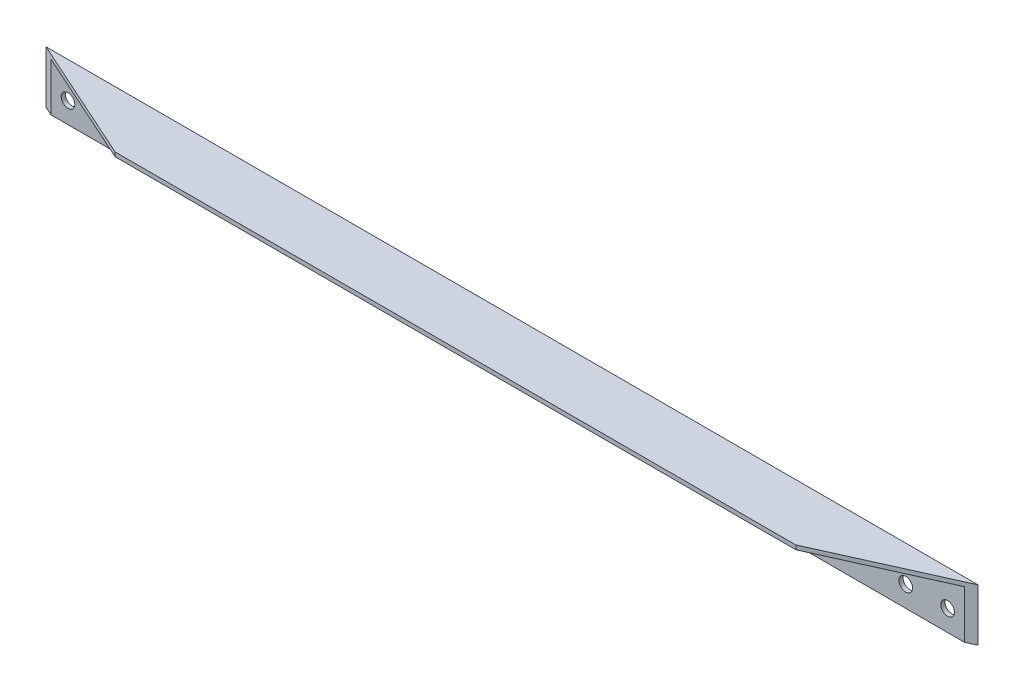
ISO-10303-21;
HEADER;
FILE_DESCRIPTION(('STEP AP214'),'2;1');
FILE_NAME('part.step','',(''),(''),'','','');
FILE_SCHEMA(('AUTOMOTIVE_DESIGN { 1 0 10303 214 1 1 1 1 }'));
ENDSEC;
DATA;
#1=APPLICATION_CONTEXT('core data for automotive mechanical design processes');
#2=APPLICATION_PROTOCOL_DEFINITION('international standard','automotive_design',2000,#1);
#3=PRODUCT_CONTEXT('',#1,'mechanical');
#4=PRODUCT('Part','Part','',(#3));
#5=PRODUCT_RELATED_PRODUCT_CATEGORY('part','',(#4));
#6=PRODUCT_DEFINITION_FORMATION('','',#4);
#7=PRODUCT_DEFINITION_CONTEXT('part definition',#1,'design');
#8=PRODUCT_DEFINITION('design','',#6,#7);
#9=PRODUCT_DEFINITION_SHAPE('','',#8);
#10=(LENGTH_UNIT() NAMED_UNIT(*) SI_UNIT(.MILLI.,.METRE.));
#11=(NAMED_UNIT(*) PLANE_ANGLE_UNIT() SI_UNIT($,.RADIAN.));
#12=(NAMED_UNIT(*) SI_UNIT($,.STERADIAN.) SOLID_ANGLE_UNIT());
#13=UNCERTAINTY_MEASURE_WITH_UNIT(LENGTH_MEASURE(1.E-05),#10,'distance_accuracy_value','');
#14=(GEOMETRIC_REPRESENTATION_CONTEXT(3) GLOBAL_UNCERTAINTY_ASSIGNED_CONTEXT((#13)) GLOBAL_UNIT_ASSIGNED_CONTEXT((#10,
#11,#12)) REPRESENTATION_CONTEXT('',''));
#15=CARTESIAN_POINT('',(0.,0.,0.));
#16=DIRECTION('',(0.,0.,1.));
#17=DIRECTION('',(1.,0.,0.));
#18=AXIS2_PLACEMENT_3D('',#15,#16,#17);
#19=CARTESIAN_POINT('',(-890.,100.,8.));
#20=DIRECTION('',(0.,0.,-1.));
#21=DIRECTION('',(-1.,0.,0.));
#22=AXIS2_PLACEMENT_3D('',#19,#20,#21);
#23=PLANE('',#22);
#24=CARTESIAN_POINT('',(-760.,39.9999999999999,8.));
#25=DIRECTION('',(0.,0.,1.));
#26=DIRECTION('',(-1.,0.,0.));
#27=AXIS2_PLACEMENT_3D('',#24,#25,#26);
#28=CIRCLE('',#27,12.9999999999998);
#29=CARTESIAN_POINT('',(-773.,39.9999999999999,8.));
#30=VERTEX_POINT('',#29);
#31=EDGE_CURVE('E106',#30,#30,#28,.T.);
#32=ORIENTED_EDGE('',*,*,#31,.F.);
#33=EDGE_LOOP('',(#32));
#34=FACE_BOUND('',#33,.T.);
#35=CARTESIAN_POINT('',(760.,39.9999999999999,8.));
#36=DIRECTION('',(0.,0.,1.));
#37=DIRECTION('',(1.,0.,0.));
#38=AXIS2_PLACEMENT_3D('',#35,#36,#37);
#39=CIRCLE('',#38,12.9999999999998);
#40=CARTESIAN_POINT('',(773.,39.9999999999999,8.));
#41=VERTEX_POINT('',#40);
#42=EDGE_CURVE('E121',#41,#41,#39,.T.);
#43=ORIENTED_EDGE('',*,*,#42,.F.);
#44=EDGE_LOOP('',(#43));
#45=FACE_BOUND('',#44,.T.);
#46=CARTESIAN_POINT('',(840.,39.9999999999999,8.));
#47=DIRECTION('',(0.,0.,1.));
#48=DIRECTION('',(1.,0.,0.));
#49=AXIS2_PLACEMENT_3D('',#46,#47,#48);
#50=CIRCLE('',#49,12.9999999999998);
#51=CARTESIAN_POINT('',(853.,39.9999999999999,8.));
#52=VERTEX_POINT('',#51);
#53=EDGE_CURVE('E127',#52,#52,#50,.T.);
#54=ORIENTED_EDGE('',*,*,#53,.F.);
#55=EDGE_LOOP('',(#54));
#56=FACE_BOUND('',#55,.T.);
#57=CARTESIAN_POINT('',(-840.,39.9999999999999,8.));
#58=DIRECTION('',(0.,0.,1.));
#59=DIRECTION('',(-1.,0.,0.));
#60=AXIS2_PLACEMENT_3D('',#57,#58,#59);
#61=CIRCLE('',#60,12.9999999999998);
#62=CARTESIAN_POINT('',(-853.,39.9999999999999,8.));
#63=VERTEX_POINT('',#62);
#64=EDGE_CURVE('E115',#63,#63,#61,.T.);
#65=ORIENTED_EDGE('',*,*,#64,.F.);
#66=EDGE_LOOP('',(#65));
#67=FACE_BOUND('',#66,.T.);
#68=DIRECTION('',(1.,0.,0.));
#69=VECTOR('',#68,1.);
#70=CARTESIAN_POINT('',(-890.,92.,8.));
#71=LINE('',#70,#69);
#72=CARTESIAN_POINT('',(-872.222222222222,92.,8.));
#73=VERTEX_POINT('',#72);
#74=CARTESIAN_POINT('',(872.222222222222,92.,8.));
#75=VERTEX_POINT('',#74);
#76=EDGE_CURVE('E38',#73,#75,#71,.T.);
#77=ORIENTED_EDGE('',*,*,#76,.F.);
#78=DIRECTION('',(0.,-1.,0.));
#79=VECTOR('',#78,1.);
#80=CARTESIAN_POINT('',(-872.222222222222,100.,8.));
#81=LINE('',#80,#79);
#82=CARTESIAN_POINT('',(-872.222222222222,0.,8.));
#83=VERTEX_POINT('',#82);
#84=EDGE_CURVE('E166',#73,#83,#81,.T.);
#85=ORIENTED_EDGE('',*,*,#84,.T.);
#86=DIRECTION('',(1.,0.,0.));
#87=VECTOR('',#86,1.);
#88=CARTESIAN_POINT('',(-890.,0.,8.));
#89=LINE('',#88,#87);
#90=CARTESIAN_POINT('',(872.222222222222,0.,8.));
#91=VERTEX_POINT('',#90);
#92=EDGE_CURVE('E133',#83,#91,#89,.T.);
#93=ORIENTED_EDGE('',*,*,#92,.T.);
#94=DIRECTION('',(0.,1.,0.));
#95=VECTOR('',#94,1.);
#96=CARTESIAN_POINT('',(872.222222222222,100.,8.));
#97=LINE('',#96,#95);
#98=EDGE_CURVE('E151',#91,#75,#97,.T.);
#99=ORIENTED_EDGE('',*,*,#98,.T.);
#100=EDGE_LOOP('',(#77,#85,#93,#99));
#101=FACE_BOUND('',#100,.T.);
#102=ADVANCED_FACE('F34',(#34,#45,#56,#67,#101),#23,.F.);
#103=CARTESIAN_POINT('',(-890.,100.,0.));
#104=DIRECTION('',(0.,0.,-1.));
#105=DIRECTION('',(-1.,0.,0.));
#106=AXIS2_PLACEMENT_3D('',#103,#104,#105);
#107=PLANE('',#106);
#108=CARTESIAN_POINT('',(-840.,39.9999999999999,0.));
#109=DIRECTION('',(0.,0.,1.));
#110=DIRECTION('',(-1.,0.,0.));
#111=AXIS2_PLACEMENT_3D('',#108,#109,#110);
#112=CIRCLE('',#111,12.9999999999998);
#113=CARTESIAN_POINT('',(-853.,39.9999999999999,0.));
#114=VERTEX_POINT('',#113);
#115=EDGE_CURVE('E113',#114,#114,#112,.T.);
#116=ORIENTED_EDGE('',*,*,#115,.T.);
#117=EDGE_LOOP('',(#116));
#118=FACE_BOUND('',#117,.T.);
#119=CARTESIAN_POINT('',(840.,39.9999999999999,0.));
#120=DIRECTION('',(0.,0.,1.));
#121=DIRECTION('',(1.,0.,0.));
#122=AXIS2_PLACEMENT_3D('',#119,#120,#121);
#123=CIRCLE('',#122,12.9999999999998);
#124=CARTESIAN_POINT('',(853.,39.9999999999999,0.));
#125=VERTEX_POINT('',#124);
#126=EDGE_CURVE('E124',#125,#125,#123,.T.);
#127=ORIENTED_EDGE('',*,*,#126,.T.);
#128=EDGE_LOOP('',(#127));
#129=FACE_BOUND('',#128,.T.);
#130=DIRECTION('',(0.,-1.,0.));
#131=VECTOR('',#130,1.);
#132=CARTESIAN_POINT('',(-890.,0.,0.));
#133=LINE('',#132,#131);
#134=CARTESIAN_POINT('',(-890.,100.,0.));
#135=VERTEX_POINT('',#134);
#136=CARTESIAN_POINT('',(-890.,0.,0.));
#137=VERTEX_POINT('',#136);
#138=EDGE_CURVE('E130',#135,#137,#133,.T.);
#139=ORIENTED_EDGE('',*,*,#138,.F.);
#140=DIRECTION('',(-1.,0.,0.));
#141=VECTOR('',#140,1.);
#142=CARTESIAN_POINT('',(-890.,100.,0.));
#143=LINE('',#142,#141);
#144=CARTESIAN_POINT('',(890.,100.,0.));
#145=VERTEX_POINT('',#144);
#146=EDGE_CURVE('E98',#145,#135,#143,.T.);
#147=ORIENTED_EDGE('',*,*,#146,.F.);
#148=DIRECTION('',(0.,1.,0.));
#149=VECTOR('',#148,1.);
#150=CARTESIAN_POINT('',(890.,0.,0.));
#151=LINE('',#150,#149);
#152=CARTESIAN_POINT('',(890.,0.,0.));
#153=VERTEX_POINT('',#152);
#154=EDGE_CURVE('E139',#153,#145,#151,.T.);
#155=ORIENTED_EDGE('',*,*,#154,.F.);
#156=DIRECTION('',(1.,0.,0.));
#157=VECTOR('',#156,1.);
#158=CARTESIAN_POINT('',(-890.,0.,0.));
#159=LINE('',#158,#157);
#160=EDGE_CURVE('E136',#137,#153,#159,.T.);
#161=ORIENTED_EDGE('',*,*,#160,.F.);
#162=EDGE_LOOP('',(#139,#147,#155,#161));
#163=FACE_BOUND('',#162,.T.);
#164=CARTESIAN_POINT('',(760.,39.9999999999999,0.));
#165=DIRECTION('',(0.,0.,1.));
#166=DIRECTION('',(1.,0.,0.));
#167=AXIS2_PLACEMENT_3D('',#164,#165,#166);
#168=CIRCLE('',#167,12.9999999999998);
#169=CARTESIAN_POINT('',(773.,39.9999999999999,0.));
#170=VERTEX_POINT('',#169);
#171=EDGE_CURVE('E118',#170,#170,#168,.T.);
#172=ORIENTED_EDGE('',*,*,#171,.T.);
#173=EDGE_LOOP('',(#172));
#174=FACE_BOUND('',#173,.T.);
#175=CARTESIAN_POINT('',(-760.,39.9999999999999,0.));
#176=DIRECTION('',(0.,0.,1.));
#177=DIRECTION('',(-1.,0.,0.));
#178=AXIS2_PLACEMENT_3D('',#175,#176,#177);
#179=CIRCLE('',#178,12.9999999999998);
#180=CARTESIAN_POINT('',(-773.,39.9999999999999,0.));
#181=VERTEX_POINT('',#180);
#182=EDGE_CURVE('E102',#181,#181,#179,.T.);
#183=ORIENTED_EDGE('',*,*,#182,.T.);
#184=EDGE_LOOP('',(#183));
#185=FACE_BOUND('',#184,.T.);
#186=ADVANCED_FACE('F170',(#118,#129,#163,#174,#185),#107,.T.);
#187=CARTESIAN_POINT('',(-890.,0.,8.));
#188=DIRECTION('',(0.,1.,0.));
#189=DIRECTION('',(0.,0.,1.));
#190=AXIS2_PLACEMENT_3D('',#187,#188,#189);
#191=PLANE('',#190);
#192=ORIENTED_EDGE('',*,*,#92,.F.);
#193=DIRECTION('',(-0.911921505175107,0.,-0.410364677328798));
#194=VECTOR('',#193,1.);
#195=CARTESIAN_POINT('',(-887.006237006237,0.,1.34719334719335));
#196=LINE('',#195,#194);
#197=EDGE_CURVE('E155',#83,#137,#196,.T.);
#198=ORIENTED_EDGE('',*,*,#197,.T.);
#199=ORIENTED_EDGE('',*,*,#160,.T.);
#200=DIRECTION('',(-0.911921505175107,0.,0.410364677328798));
#201=VECTOR('',#200,1.);
#202=CARTESIAN_POINT('',(-593.243243243243,0.,667.459459459459));
#203=LINE('',#202,#201);
#204=EDGE_CURVE('E153',#153,#91,#203,.T.);
#205=ORIENTED_EDGE('',*,*,#204,.T.);
#206=EDGE_LOOP('',(#192,#198,#199,#205));
#207=FACE_BOUND('',#206,.T.);
#208=ADVANCED_FACE('F36',(#207),#191,.F.);
#209=CARTESIAN_POINT('',(-890.,100.,8.));
#210=DIRECTION('',(0.,-1.,0.));
#211=DIRECTION('',(0.,0.,-1.));
#212=AXIS2_PLACEMENT_3D('',#209,#210,#211);
#213=PLANE('',#212);
#214=ORIENTED_EDGE('',*,*,#146,.T.);
#215=DIRECTION('',(-0.911921505175107,0.,-0.410364677328798));
#216=VECTOR('',#215,1.);
#217=CARTESIAN_POINT('',(-650.,100.,108.));
#218=LINE('',#217,#216);
#219=CARTESIAN_POINT('',(-650.,100.,108.));
#220=VERTEX_POINT('',#219);
#221=EDGE_CURVE('E88',#220,#135,#218,.T.);
#222=ORIENTED_EDGE('',*,*,#221,.F.);
#223=DIRECTION('',(-1.,0.,0.));
#224=VECTOR('',#223,1.);
#225=CARTESIAN_POINT('',(-890.,100.,108.));
#226=LINE('',#225,#224);
#227=CARTESIAN_POINT('',(650.,100.,108.));
#228=VERTEX_POINT('',#227);
#229=EDGE_CURVE('E96',#228,#220,#226,.T.);
#230=ORIENTED_EDGE('',*,*,#229,.F.);
#231=DIRECTION('',(-0.911921505175107,0.,0.410364677328798));
#232=VECTOR('',#231,1.);
#233=CARTESIAN_POINT('',(650.,100.,108.));
#234=LINE('',#233,#232);
#235=EDGE_CURVE('E58',#145,#228,#234,.T.);
#236=ORIENTED_EDGE('',*,*,#235,.F.);
#237=EDGE_LOOP('',(#214,#222,#230,#236));
#238=FACE_BOUND('',#237,.T.);
#239=ADVANCED_FACE('F95',(#238),#213,.F.);
#240=CARTESIAN_POINT('',(840.,39.9999999999999,8.));
#241=DIRECTION('',(0.,0.,-1.));
#242=DIRECTION('',(-1.,0.,0.));
#243=AXIS2_PLACEMENT_3D('',#240,#241,#242);
#244=CYLINDRICAL_SURFACE('',#243,12.9999999999998);
#245=ORIENTED_EDGE('',*,*,#53,.T.);
#246=EDGE_LOOP('',(#245));
#247=FACE_BOUND('',#246,.T.);
#248=ORIENTED_EDGE('',*,*,#126,.F.);
#249=EDGE_LOOP('',(#248));
#250=FACE_BOUND('',#249,.T.);
#251=ADVANCED_FACE('F200',(#247,#250),#244,.F.);
#252=CARTESIAN_POINT('',(760.,39.9999999999999,8.));
#253=DIRECTION('',(0.,0.,-1.));
#254=DIRECTION('',(-1.,0.,0.));
#255=AXIS2_PLACEMENT_3D('',#252,#253,#254);
#256=CYLINDRICAL_SURFACE('',#255,12.9999999999998);
#257=ORIENTED_EDGE('',*,*,#42,.T.);
#258=EDGE_LOOP('',(#257));
#259=FACE_BOUND('',#258,.T.);
#260=ORIENTED_EDGE('',*,*,#171,.F.);
#261=EDGE_LOOP('',(#260));
#262=FACE_BOUND('',#261,.T.);
#263=ADVANCED_FACE('F189',(#259,#262),#256,.F.);
#264=CARTESIAN_POINT('',(-840.,39.9999999999999,8.));
#265=DIRECTION('',(0.,0.,-1.));
#266=DIRECTION('',(-1.,0.,0.));
#267=AXIS2_PLACEMENT_3D('',#264,#265,#266);
#268=CYLINDRICAL_SURFACE('',#267,12.9999999999998);
#269=ORIENTED_EDGE('',*,*,#64,.T.);
#270=EDGE_LOOP('',(#269));
#271=FACE_BOUND('',#270,.T.);
#272=ORIENTED_EDGE('',*,*,#115,.F.);
#273=EDGE_LOOP('',(#272));
#274=FACE_BOUND('',#273,.T.);
#275=ADVANCED_FACE('F181',(#271,#274),#268,.F.);
#276=CARTESIAN_POINT('',(-760.,39.9999999999999,8.));
#277=DIRECTION('',(0.,0.,-1.));
#278=DIRECTION('',(-1.,0.,0.));
#279=AXIS2_PLACEMENT_3D('',#276,#277,#278);
#280=CYLINDRICAL_SURFACE('',#279,12.9999999999998);
#281=ORIENTED_EDGE('',*,*,#31,.T.);
#282=EDGE_LOOP('',(#281));
#283=FACE_BOUND('',#282,.T.);
#284=ORIENTED_EDGE('',*,*,#182,.F.);
#285=EDGE_LOOP('',(#284));
#286=FACE_BOUND('',#285,.T.);
#287=ADVANCED_FACE('F179',(#283,#286),#280,.F.);
#288=CARTESIAN_POINT('',(-890.,92.,108.));
#289=DIRECTION('',(0.,1.,0.));
#290=DIRECTION('',(0.,0.,1.));
#291=AXIS2_PLACEMENT_3D('',#288,#289,#290);
#292=PLANE('',#291);
#293=DIRECTION('',(1.,0.,0.));
#294=VECTOR('',#293,1.);
#295=CARTESIAN_POINT('',(-890.,92.,108.));
#296=LINE('',#295,#294);
#297=CARTESIAN_POINT('',(-650.,92.,108.));
#298=VERTEX_POINT('',#297);
#299=CARTESIAN_POINT('',(650.,92.,108.));
#300=VERTEX_POINT('',#299);
#301=EDGE_CURVE('E103',#298,#300,#296,.T.);
#302=ORIENTED_EDGE('',*,*,#301,.F.);
#303=DIRECTION('',(-0.911921505175107,0.,-0.410364677328798));
#304=VECTOR('',#303,1.);
#305=CARTESIAN_POINT('',(-849.5841995842,92.,18.1871101871102));
#306=LINE('',#305,#304);
#307=EDGE_CURVE('E50',#298,#73,#306,.T.);
#308=ORIENTED_EDGE('',*,*,#307,.T.);
#309=ORIENTED_EDGE('',*,*,#76,.T.);
#310=DIRECTION('',(-0.911921505175107,0.,0.410364677328798));
#311=VECTOR('',#310,1.);
#312=CARTESIAN_POINT('',(-630.665280665281,92.,684.299376299376));
#313=LINE('',#312,#311);
#314=EDGE_CURVE('E146',#75,#300,#313,.T.);
#315=ORIENTED_EDGE('',*,*,#314,.T.);
#316=EDGE_LOOP('',(#302,#308,#309,#315));
#317=FACE_BOUND('',#316,.T.);
#318=ADVANCED_FACE('F149',(#317),#292,.F.);
#319=CARTESIAN_POINT('',(-890.,92.,108.));
#320=DIRECTION('',(0.,0.,1.));
#321=DIRECTION('',(1.,0.,0.));
#322=AXIS2_PLACEMENT_3D('',#319,#320,#321);
#323=PLANE('',#322);
#324=DIRECTION('',(0.,1.,0.));
#325=VECTOR('',#324,1.);
#326=CARTESIAN_POINT('',(-650.,92.,108.));
#327=LINE('',#326,#325);
#328=EDGE_CURVE('E11',#298,#220,#327,.T.);
#329=ORIENTED_EDGE('',*,*,#328,.F.);
#330=ORIENTED_EDGE('',*,*,#301,.T.);
#331=DIRECTION('',(0.,-1.,0.));
#332=VECTOR('',#331,1.);
#333=CARTESIAN_POINT('',(650.,92.,108.));
#334=LINE('',#333,#332);
#335=EDGE_CURVE('E44',#228,#300,#334,.T.);
#336=ORIENTED_EDGE('',*,*,#335,.F.);
#337=ORIENTED_EDGE('',*,*,#229,.T.);
#338=EDGE_LOOP('',(#329,#330,#336,#337));
#339=FACE_BOUND('',#338,.T.);
#340=ADVANCED_FACE('F101',(#339),#323,.T.);
#341=CARTESIAN_POINT('',(650.,-2.50000000007189E-05,108.));
#342=DIRECTION('',(-0.410364677328798,0.,-0.911921505175107));
#343=DIRECTION('',(-0.911921505175107,0.,0.410364677328798));
#344=AXIS2_PLACEMENT_3D('',#341,#342,#343);
#345=PLANE('',#344);
#346=ORIENTED_EDGE('',*,*,#154,.T.);
#347=ORIENTED_EDGE('',*,*,#235,.T.);
#348=ORIENTED_EDGE('',*,*,#335,.T.);
#349=ORIENTED_EDGE('',*,*,#314,.F.);
#350=ORIENTED_EDGE('',*,*,#98,.F.);
#351=ORIENTED_EDGE('',*,*,#204,.F.);
#352=EDGE_LOOP('',(#346,#347,#348,#349,#350,#351));
#353=FACE_BOUND('',#352,.T.);
#354=ADVANCED_FACE('F144',(#353),#345,.F.);
#355=CARTESIAN_POINT('',(-650.,-2.50000000007189E-05,108.));
#356=DIRECTION('',(0.410364677328798,0.,-0.911921505175107));
#357=DIRECTION('',(-0.911921505175107,0.,-0.410364677328798));
#358=AXIS2_PLACEMENT_3D('',#355,#356,#357);
#359=PLANE('',#358);
#360=ORIENTED_EDGE('',*,*,#84,.F.);
#361=ORIENTED_EDGE('',*,*,#307,.F.);
#362=ORIENTED_EDGE('',*,*,#328,.T.);
#363=ORIENTED_EDGE('',*,*,#221,.T.);
#364=ORIENTED_EDGE('',*,*,#138,.T.);
#365=ORIENTED_EDGE('',*,*,#197,.F.);
#366=EDGE_LOOP('',(#360,#361,#362,#363,#364,#365));
#367=FACE_BOUND('',#366,.T.);
#368=ADVANCED_FACE('F87',(#367),#359,.F.);
#369=CLOSED_SHELL('',(#102,#186,#208,#239,#251,#263,#275,#287,#318,#340,#354,#368));
#370=MANIFOLD_SOLID_BREP('B2',#369);
#371=ADVANCED_BREP_SHAPE_REPRESENTATION('',(#18,#370),#14);
#372=SHAPE_DEFINITION_REPRESENTATION(#9,#371);
ENDSEC;
END-ISO-10303-21;
